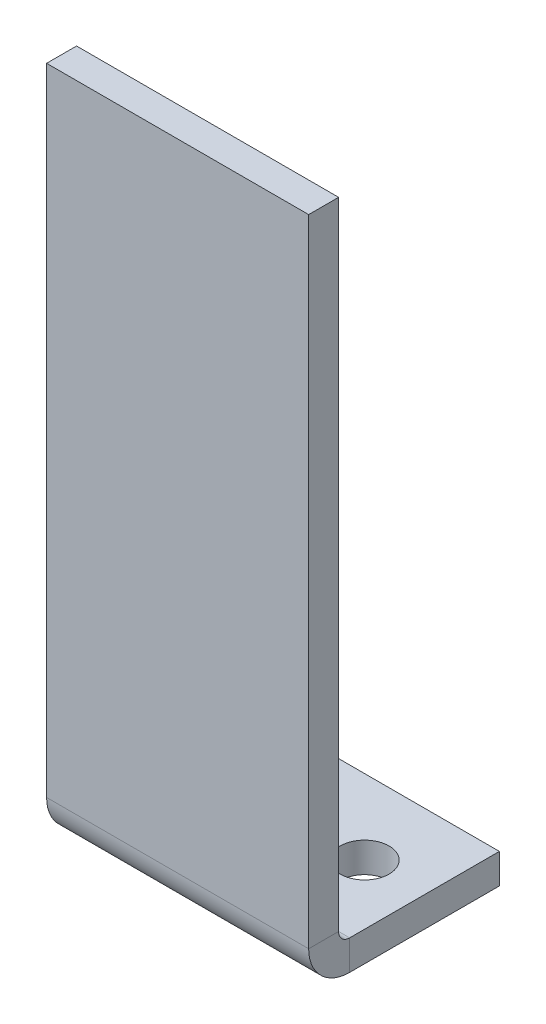
ISO-10303-21;
HEADER;
FILE_DESCRIPTION(('STEP AP214'),'2;1');
FILE_NAME('part.step','',(''),(''),'','','');
FILE_SCHEMA(('AUTOMOTIVE_DESIGN { 1 0 10303 214 1 1 1 1 }'));
ENDSEC;
DATA;
#1=APPLICATION_CONTEXT('core data for automotive mechanical design processes');
#2=APPLICATION_PROTOCOL_DEFINITION('international standard','automotive_design',2000,#1);
#3=PRODUCT_CONTEXT('',#1,'mechanical');
#4=PRODUCT('Part','Part','',(#3));
#5=PRODUCT_RELATED_PRODUCT_CATEGORY('part','',(#4));
#6=PRODUCT_DEFINITION_FORMATION('','',#4);
#7=PRODUCT_DEFINITION_CONTEXT('part definition',#1,'design');
#8=PRODUCT_DEFINITION('design','',#6,#7);
#9=PRODUCT_DEFINITION_SHAPE('','',#8);
#10=(LENGTH_UNIT() NAMED_UNIT(*) SI_UNIT(.MILLI.,.METRE.));
#11=(NAMED_UNIT(*) PLANE_ANGLE_UNIT() SI_UNIT($,.RADIAN.));
#12=(NAMED_UNIT(*) SI_UNIT($,.STERADIAN.) SOLID_ANGLE_UNIT());
#13=UNCERTAINTY_MEASURE_WITH_UNIT(LENGTH_MEASURE(1.E-05),#10,'distance_accuracy_value','');
#14=(GEOMETRIC_REPRESENTATION_CONTEXT(3) GLOBAL_UNCERTAINTY_ASSIGNED_CONTEXT((#13)) GLOBAL_UNIT_ASSIGNED_CONTEXT((#10,
#11,#12)) REPRESENTATION_CONTEXT('',''));
#15=CARTESIAN_POINT('',(0.,0.,0.));
#16=DIRECTION('',(0.,0.,1.));
#17=DIRECTION('',(1.,0.,0.));
#18=AXIS2_PLACEMENT_3D('',#15,#16,#17);
#19=CARTESIAN_POINT('',(0.,0.,0.));
#20=DIRECTION('',(0.,1.,0.));
#21=DIRECTION('',(0.,0.,1.));
#22=AXIS2_PLACEMENT_3D('',#19,#20,#21);
#23=PLANE('',#22);
#24=CARTESIAN_POINT('',(-19.2867132867133,0.,-16.3298368298368));
#25=DIRECTION('',(0.,1.,0.));
#26=DIRECTION('',(0.,0.,1.));
#27=AXIS2_PLACEMENT_3D('',#24,#25,#26);
#28=CIRCLE('',#27,1.63195);
#29=CARTESIAN_POINT('',(-19.2867132867133,0.,-14.6978868298368));
#30=VERTEX_POINT('',#29);
#31=EDGE_CURVE('E362',#30,#30,#28,.F.);
#32=ORIENTED_EDGE('',*,*,#31,.T.);
#33=EDGE_LOOP('',(#32));
#34=FACE_BOUND('',#33,.T.);
#35=DIRECTION('',(-1.,0.,0.));
#36=VECTOR('',#35,1.);
#37=CARTESIAN_POINT('',(0.,0.,-11.3298368298368));
#38=LINE('',#37,#36);
#39=CARTESIAN_POINT('',(-5.78671328671329,0.,-11.3298368298368));
#40=VERTEX_POINT('',#39);
#41=CARTESIAN_POINT('',(-23.2867132867133,0.,-11.3298368298368));
#42=VERTEX_POINT('',#41);
#43=EDGE_CURVE('E147',#40,#42,#38,.T.);
#44=ORIENTED_EDGE('',*,*,#43,.F.);
#45=DIRECTION('',(0.,0.,-1.));
#46=VECTOR('',#45,1.);
#47=CARTESIAN_POINT('',(-5.78671328671329,0.,-21.3298368298368));
#48=LINE('',#47,#46);
#49=CARTESIAN_POINT('',(-5.78671328671329,0.,-21.3298368298368));
#50=VERTEX_POINT('',#49);
#51=EDGE_CURVE('E168',#40,#50,#48,.T.);
#52=ORIENTED_EDGE('',*,*,#51,.T.);
#53=DIRECTION('',(-1.,0.,0.));
#54=VECTOR('',#53,1.);
#55=CARTESIAN_POINT('',(-23.2867132867133,0.,-21.3298368298368));
#56=LINE('',#55,#54);
#57=CARTESIAN_POINT('',(-23.2867132867133,0.,-21.3298368298368));
#58=VERTEX_POINT('',#57);
#59=EDGE_CURVE('E165',#50,#58,#56,.T.);
#60=ORIENTED_EDGE('',*,*,#59,.T.);
#61=DIRECTION('',(0.,0.,1.));
#62=VECTOR('',#61,1.);
#63=CARTESIAN_POINT('',(-23.2867132867133,0.,-21.3298368298368));
#64=LINE('',#63,#62);
#65=EDGE_CURVE('E163',#58,#42,#64,.T.);
#66=ORIENTED_EDGE('',*,*,#65,.T.);
#67=EDGE_LOOP('',(#44,#52,#60,#66));
#68=FACE_BOUND('',#67,.T.);
#69=CARTESIAN_POINT('',(-9.78671328671329,0.,-16.3298368298368));
#70=DIRECTION('',(0.,1.,0.));
#71=DIRECTION('',(0.,0.,1.));
#72=AXIS2_PLACEMENT_3D('',#69,#70,#71);
#73=CIRCLE('',#72,1.63195);
#74=CARTESIAN_POINT('',(-9.78671328671329,0.,-14.6978868298368));
#75=VERTEX_POINT('',#74);
#76=EDGE_CURVE('E157',#75,#75,#73,.F.);
#77=ORIENTED_EDGE('',*,*,#76,.T.);
#78=EDGE_LOOP('',(#77));
#79=FACE_BOUND('',#78,.T.);
#80=ADVANCED_FACE('F47',(#34,#68,#79),#23,.T.);
#81=CARTESIAN_POINT('',(-23.2867132867133,-11.8027493418966,-8.59323682983679));
#82=DIRECTION('',(-1.,0.,0.));
#83=DIRECTION('',(0.,1.,0.));
#84=AXIS2_PLACEMENT_3D('',#81,#82,#83);
#85=PLANE('',#84);
#86=DIRECTION('',(0.,1.,0.));
#87=VECTOR('',#86,1.);
#88=CARTESIAN_POINT('',(-23.2867132867133,-11.8027493418966,-10.5932368298368));
#89=LINE('',#88,#87);
#90=CARTESIAN_POINT('',(-23.2867132867133,0.736600000000002,-10.5932368298368));
#91=VERTEX_POINT('',#90);
#92=CARTESIAN_POINT('',(-23.2867132867133,43.1972506581034,-10.593236829837));
#93=VERTEX_POINT('',#92);
#94=EDGE_CURVE('E71',#91,#93,#89,.T.);
#95=ORIENTED_EDGE('',*,*,#94,.F.);
#96=DIRECTION('',(0.,0.,1.));
#97=VECTOR('',#96,1.);
#98=CARTESIAN_POINT('',(-23.2867132867133,0.736600000000009,-8.59323682983683));
#99=LINE('',#98,#97);
#100=CARTESIAN_POINT('',(-23.2867132867133,0.73660000000001,-8.59323682983683));
#101=VERTEX_POINT('',#100);
#102=EDGE_CURVE('E112',#91,#101,#99,.T.);
#103=ORIENTED_EDGE('',*,*,#102,.T.);
#104=DIRECTION('',(0.,1.,0.));
#105=VECTOR('',#104,1.);
#106=CARTESIAN_POINT('',(-23.2867132867133,-11.8027493418966,-8.59323682983679));
#107=LINE('',#106,#105);
#108=CARTESIAN_POINT('',(-23.2867132867133,43.1972506581034,-8.59323682983698));
#109=VERTEX_POINT('',#108);
#110=EDGE_CURVE('E51',#101,#109,#107,.T.);
#111=ORIENTED_EDGE('',*,*,#110,.T.);
#112=DIRECTION('',(0.,0.,-1.));
#113=VECTOR('',#112,1.);
#114=CARTESIAN_POINT('',(-23.2867132867133,43.1972506581034,-8.59323682983698));
#115=LINE('',#114,#113);
#116=EDGE_CURVE('E188',#109,#93,#115,.T.);
#117=ORIENTED_EDGE('',*,*,#116,.T.);
#118=EDGE_LOOP('',(#95,#103,#111,#117));
#119=FACE_BOUND('',#118,.T.);
#120=ADVANCED_FACE('F114',(#119),#85,.T.);
#121=CARTESIAN_POINT('',(-5.78671328671329,-11.8027493418966,-8.59323682983679));
#122=DIRECTION('',(1.,0.,0.));
#123=DIRECTION('',(0.,-1.,0.));
#124=AXIS2_PLACEMENT_3D('',#121,#122,#123);
#125=PLANE('',#124);
#126=DIRECTION('',(0.,-1.,0.));
#127=VECTOR('',#126,1.);
#128=CARTESIAN_POINT('',(-5.78671328671329,-11.8027493418966,-8.59323682983679));
#129=LINE('',#128,#127);
#130=CARTESIAN_POINT('',(-5.78671328671328,43.1972506581034,-8.59323682983698));
#131=VERTEX_POINT('',#130);
#132=CARTESIAN_POINT('',(-5.78671328671329,0.736600000000009,-8.59323682983683));
#133=VERTEX_POINT('',#132);
#134=EDGE_CURVE('E184',#131,#133,#129,.T.);
#135=ORIENTED_EDGE('',*,*,#134,.T.);
#136=DIRECTION('',(0.,0.,-1.));
#137=VECTOR('',#136,1.);
#138=CARTESIAN_POINT('',(-5.78671328671329,0.736600000000009,-8.59323682983683));
#139=LINE('',#138,#137);
#140=CARTESIAN_POINT('',(-5.78671328671329,0.736600000000002,-10.5932368298368));
#141=VERTEX_POINT('',#140);
#142=EDGE_CURVE('E12',#133,#141,#139,.T.);
#143=ORIENTED_EDGE('',*,*,#142,.T.);
#144=DIRECTION('',(0.,-1.,0.));
#145=VECTOR('',#144,1.);
#146=CARTESIAN_POINT('',(-5.78671328671329,-11.8027493418966,-10.5932368298368));
#147=LINE('',#146,#145);
#148=CARTESIAN_POINT('',(-5.78671328671328,43.1972506581034,-10.593236829837));
#149=VERTEX_POINT('',#148);
#150=EDGE_CURVE('E64',#149,#141,#147,.T.);
#151=ORIENTED_EDGE('',*,*,#150,.F.);
#152=DIRECTION('',(0.,0.,-1.));
#153=VECTOR('',#152,1.);
#154=CARTESIAN_POINT('',(-5.78671328671328,43.1972506581034,-8.59323682983698));
#155=LINE('',#154,#153);
#156=EDGE_CURVE('E138',#131,#149,#155,.T.);
#157=ORIENTED_EDGE('',*,*,#156,.F.);
#158=EDGE_LOOP('',(#135,#143,#151,#157));
#159=FACE_BOUND('',#158,.T.);
#160=ADVANCED_FACE('F49',(#159),#125,.T.);
#161=CARTESIAN_POINT('',(0.,9.52708748794019,-10.5932368298369));
#162=DIRECTION('',(0.,0.,-1.));
#163=DIRECTION('',(0.,1.,0.));
#164=AXIS2_PLACEMENT_3D('',#161,#162,#163);
#165=PLANE('',#164);
#166=ORIENTED_EDGE('',*,*,#150,.T.);
#167=DIRECTION('',(-1.,0.,0.));
#168=VECTOR('',#167,1.);
#169=CARTESIAN_POINT('',(0.,0.736600000000002,-10.5932368298368));
#170=LINE('',#169,#168);
#171=EDGE_CURVE('E56',#141,#91,#170,.T.);
#172=ORIENTED_EDGE('',*,*,#171,.T.);
#173=ORIENTED_EDGE('',*,*,#94,.T.);
#174=DIRECTION('',(1.,0.,0.));
#175=VECTOR('',#174,1.);
#176=CARTESIAN_POINT('',(-23.2867132867133,43.1972506581034,-10.593236829837));
#177=LINE('',#176,#175);
#178=EDGE_CURVE('E185',#93,#149,#177,.T.);
#179=ORIENTED_EDGE('',*,*,#178,.T.);
#180=EDGE_LOOP('',(#166,#172,#173,#179));
#181=FACE_BOUND('',#180,.T.);
#182=ADVANCED_FACE('F192',(#181),#165,.T.);
#183=CARTESIAN_POINT('',(-23.2867132867133,43.1972506581034,-8.59323682983698));
#184=DIRECTION('',(0.,1.,0.));
#185=DIRECTION('',(1.,0.,0.));
#186=AXIS2_PLACEMENT_3D('',#183,#184,#185);
#187=PLANE('',#186);
#188=ORIENTED_EDGE('',*,*,#178,.F.);
#189=ORIENTED_EDGE('',*,*,#116,.F.);
#190=DIRECTION('',(1.,0.,0.));
#191=VECTOR('',#190,1.);
#192=CARTESIAN_POINT('',(-23.2867132867133,43.1972506581034,-8.59323682983698));
#193=LINE('',#192,#191);
#194=EDGE_CURVE('E129',#109,#131,#193,.T.);
#195=ORIENTED_EDGE('',*,*,#194,.T.);
#196=ORIENTED_EDGE('',*,*,#156,.T.);
#197=EDGE_LOOP('',(#188,#189,#195,#196));
#198=FACE_BOUND('',#197,.T.);
#199=ADVANCED_FACE('F196',(#198),#187,.T.);
#200=CARTESIAN_POINT('',(0.,9.5270874879402,-8.59323682983686));
#201=DIRECTION('',(0.,0.,-1.));
#202=DIRECTION('',(0.,1.,0.));
#203=AXIS2_PLACEMENT_3D('',#200,#201,#202);
#204=PLANE('',#203);
#205=DIRECTION('',(-1.,0.,0.));
#206=VECTOR('',#205,1.);
#207=CARTESIAN_POINT('',(0.,0.736600000000009,-8.59323682983683));
#208=LINE('',#207,#206);
#209=EDGE_CURVE('E120',#133,#101,#208,.T.);
#210=ORIENTED_EDGE('',*,*,#209,.F.);
#211=ORIENTED_EDGE('',*,*,#134,.F.);
#212=ORIENTED_EDGE('',*,*,#194,.F.);
#213=ORIENTED_EDGE('',*,*,#110,.F.);
#214=EDGE_LOOP('',(#210,#211,#212,#213));
#215=FACE_BOUND('',#214,.T.);
#216=ADVANCED_FACE('F125',(#215),#204,.F.);
#217=CARTESIAN_POINT('',(-23.2867132867133,-2.,-21.3298368298368));
#218=DIRECTION('',(0.,0.,-1.));
#219=DIRECTION('',(-1.,0.,0.));
#220=AXIS2_PLACEMENT_3D('',#217,#218,#219);
#221=PLANE('',#220);
#222=ORIENTED_EDGE('',*,*,#59,.F.);
#223=DIRECTION('',(0.,1.,0.));
#224=VECTOR('',#223,1.);
#225=CARTESIAN_POINT('',(-5.78671328671329,-2.,-21.3298368298368));
#226=LINE('',#225,#224);
#227=CARTESIAN_POINT('',(-5.78671328671329,-2.,-21.3298368298368));
#228=VERTEX_POINT('',#227);
#229=EDGE_CURVE('E158',#228,#50,#226,.T.);
#230=ORIENTED_EDGE('',*,*,#229,.F.);
#231=DIRECTION('',(-1.,0.,0.));
#232=VECTOR('',#231,1.);
#233=CARTESIAN_POINT('',(-23.2867132867133,-2.,-21.3298368298368));
#234=LINE('',#233,#232);
#235=CARTESIAN_POINT('',(-23.2867132867133,-2.,-21.3298368298368));
#236=VERTEX_POINT('',#235);
#237=EDGE_CURVE('E177',#228,#236,#234,.T.);
#238=ORIENTED_EDGE('',*,*,#237,.T.);
#239=DIRECTION('',(0.,1.,0.));
#240=VECTOR('',#239,1.);
#241=CARTESIAN_POINT('',(-23.2867132867133,-2.,-21.3298368298368));
#242=LINE('',#241,#240);
#243=EDGE_CURVE('E175',#236,#58,#242,.T.);
#244=ORIENTED_EDGE('',*,*,#243,.T.);
#245=EDGE_LOOP('',(#222,#230,#238,#244));
#246=FACE_BOUND('',#245,.T.);
#247=ADVANCED_FACE('F220',(#246),#221,.T.);
#248=CARTESIAN_POINT('',(0.,-2.,0.));
#249=DIRECTION('',(0.,1.,0.));
#250=DIRECTION('',(0.,0.,1.));
#251=AXIS2_PLACEMENT_3D('',#248,#249,#250);
#252=PLANE('',#251);
#253=CARTESIAN_POINT('',(-19.2867132867133,-2.,-16.3298368298368));
#254=DIRECTION('',(0.,-1.,0.));
#255=DIRECTION('',(0.,0.,-1.));
#256=AXIS2_PLACEMENT_3D('',#253,#254,#255);
#257=CIRCLE('',#256,1.63195);
#258=CARTESIAN_POINT('',(-19.2867132867133,-2.,-17.9617868298368));
#259=VERTEX_POINT('',#258);
#260=EDGE_CURVE('E365',#259,#259,#257,.T.);
#261=ORIENTED_EDGE('',*,*,#260,.F.);
#262=EDGE_LOOP('',(#261));
#263=FACE_BOUND('',#262,.T.);
#264=CARTESIAN_POINT('',(-9.78671328671329,-2.,-16.3298368298368));
#265=DIRECTION('',(0.,-1.,0.));
#266=DIRECTION('',(0.,0.,-1.));
#267=AXIS2_PLACEMENT_3D('',#264,#265,#266);
#268=CIRCLE('',#267,1.63195);
#269=CARTESIAN_POINT('',(-9.78671328671329,-2.,-17.9617868298368));
#270=VERTEX_POINT('',#269);
#271=EDGE_CURVE('E367',#270,#270,#268,.T.);
#272=ORIENTED_EDGE('',*,*,#271,.F.);
#273=EDGE_LOOP('',(#272));
#274=FACE_BOUND('',#273,.T.);
#275=DIRECTION('',(0.,0.,-1.));
#276=VECTOR('',#275,1.);
#277=CARTESIAN_POINT('',(-5.78671328671329,-2.,-21.3298368298368));
#278=LINE('',#277,#276);
#279=CARTESIAN_POINT('',(-5.78671328671329,-2.,-11.3298368298368));
#280=VERTEX_POINT('',#279);
#281=EDGE_CURVE('E161',#280,#228,#278,.T.);
#282=ORIENTED_EDGE('',*,*,#281,.F.);
#283=DIRECTION('',(-1.,0.,0.));
#284=VECTOR('',#283,1.);
#285=CARTESIAN_POINT('',(0.,-2.,-11.3298368298368));
#286=LINE('',#285,#284);
#287=CARTESIAN_POINT('',(-23.2867132867133,-2.,-11.3298368298368));
#288=VERTEX_POINT('',#287);
#289=EDGE_CURVE('E172',#280,#288,#286,.T.);
#290=ORIENTED_EDGE('',*,*,#289,.T.);
#291=DIRECTION('',(0.,0.,1.));
#292=VECTOR('',#291,1.);
#293=CARTESIAN_POINT('',(-23.2867132867133,-2.,-21.3298368298368));
#294=LINE('',#293,#292);
#295=EDGE_CURVE('E170',#236,#288,#294,.T.);
#296=ORIENTED_EDGE('',*,*,#295,.F.);
#297=ORIENTED_EDGE('',*,*,#237,.F.);
#298=EDGE_LOOP('',(#282,#290,#296,#297));
#299=FACE_BOUND('',#298,.T.);
#300=ADVANCED_FACE('F218',(#263,#274,#299),#252,.F.);
#301=CARTESIAN_POINT('',(-23.2867132867133,-2.,-21.3298368298368));
#302=DIRECTION('',(-1.,0.,0.));
#303=DIRECTION('',(0.,0.,1.));
#304=AXIS2_PLACEMENT_3D('',#301,#302,#303);
#305=PLANE('',#304);
#306=DIRECTION('',(0.,-1.,0.));
#307=VECTOR('',#306,1.);
#308=CARTESIAN_POINT('',(-23.2867132867133,-2.,-11.3298368298368));
#309=LINE('',#308,#307);
#310=EDGE_CURVE('E143',#42,#288,#309,.T.);
#311=ORIENTED_EDGE('',*,*,#310,.F.);
#312=ORIENTED_EDGE('',*,*,#65,.F.);
#313=ORIENTED_EDGE('',*,*,#243,.F.);
#314=ORIENTED_EDGE('',*,*,#295,.T.);
#315=EDGE_LOOP('',(#311,#312,#313,#314));
#316=FACE_BOUND('',#315,.T.);
#317=ADVANCED_FACE('F214',(#316),#305,.T.);
#318=CARTESIAN_POINT('',(-5.78671328671329,-2.,-21.3298368298368));
#319=DIRECTION('',(1.,0.,0.));
#320=DIRECTION('',(0.,0.,-1.));
#321=AXIS2_PLACEMENT_3D('',#318,#319,#320);
#322=PLANE('',#321);
#323=DIRECTION('',(0.,1.,0.));
#324=VECTOR('',#323,1.);
#325=CARTESIAN_POINT('',(-5.78671328671329,-2.,-11.3298368298368));
#326=LINE('',#325,#324);
#327=EDGE_CURVE('E144',#280,#40,#326,.T.);
#328=ORIENTED_EDGE('',*,*,#327,.F.);
#329=ORIENTED_EDGE('',*,*,#281,.T.);
#330=ORIENTED_EDGE('',*,*,#229,.T.);
#331=ORIENTED_EDGE('',*,*,#51,.F.);
#332=EDGE_LOOP('',(#328,#329,#330,#331));
#333=FACE_BOUND('',#332,.T.);
#334=ADVANCED_FACE('F206',(#333),#322,.T.);
#335=CARTESIAN_POINT('',(-5.78671328671328,0.7366,-11.3298368298368));
#336=DIRECTION('',(1.,0.,0.));
#337=DIRECTION('',(0.,0.,-1.));
#338=AXIS2_PLACEMENT_3D('',#335,#336,#337);
#339=PLANE('',#338);
#340=ORIENTED_EDGE('',*,*,#327,.T.);
#341=CARTESIAN_POINT('',(-5.78671328671328,0.7366,-11.3298368298368));
#342=DIRECTION('',(-1.,0.,0.));
#343=DIRECTION('',(0.,0.,1.));
#344=AXIS2_PLACEMENT_3D('',#341,#342,#343);
#345=CIRCLE('',#344,0.7366);
#346=EDGE_CURVE('E154',#40,#141,#345,.T.);
#347=ORIENTED_EDGE('',*,*,#346,.T.);
#348=ORIENTED_EDGE('',*,*,#142,.F.);
#349=CARTESIAN_POINT('',(-5.78671328671328,0.7366,-11.3298368298368));
#350=DIRECTION('',(-1.,0.,0.));
#351=DIRECTION('',(0.,0.,-1.));
#352=AXIS2_PLACEMENT_3D('',#349,#350,#351);
#353=CIRCLE('',#352,2.7366);
#354=EDGE_CURVE('E137',#280,#133,#353,.T.);
#355=ORIENTED_EDGE('',*,*,#354,.F.);
#356=EDGE_LOOP('',(#340,#347,#348,#355));
#357=FACE_BOUND('',#356,.T.);
#358=ADVANCED_FACE('F203',(#357),#339,.T.);
#359=CARTESIAN_POINT('',(-23.2867132867133,0.7366,-11.3298368298368));
#360=DIRECTION('',(-1.,0.,0.));
#361=DIRECTION('',(0.,0.,1.));
#362=AXIS2_PLACEMENT_3D('',#359,#360,#361);
#363=PLANE('',#362);
#364=ORIENTED_EDGE('',*,*,#102,.F.);
#365=CARTESIAN_POINT('',(-23.2867132867133,0.7366,-11.3298368298368));
#366=DIRECTION('',(-1.,0.,0.));
#367=DIRECTION('',(0.,0.,1.));
#368=AXIS2_PLACEMENT_3D('',#365,#366,#367);
#369=CIRCLE('',#368,0.7366);
#370=EDGE_CURVE('E149',#91,#42,#369,.F.);
#371=ORIENTED_EDGE('',*,*,#370,.T.);
#372=ORIENTED_EDGE('',*,*,#310,.T.);
#373=CARTESIAN_POINT('',(-23.2867132867133,0.7366,-11.3298368298368));
#374=DIRECTION('',(1.,0.,0.));
#375=DIRECTION('',(0.,0.,1.));
#376=AXIS2_PLACEMENT_3D('',#373,#374,#375);
#377=CIRCLE('',#376,2.7366);
#378=EDGE_CURVE('E135',#101,#288,#377,.T.);
#379=ORIENTED_EDGE('',*,*,#378,.F.);
#380=EDGE_LOOP('',(#364,#371,#372,#379));
#381=FACE_BOUND('',#380,.T.);
#382=ADVANCED_FACE('F141',(#381),#363,.T.);
#383=CARTESIAN_POINT('',(3.25930579285029,0.7366,-11.3298368298368));
#384=DIRECTION('',(-1.,0.,0.));
#385=DIRECTION('',(0.,0.,1.));
#386=AXIS2_PLACEMENT_3D('',#383,#384,#385);
#387=CYLINDRICAL_SURFACE('',#386,2.7366);
#388=ORIENTED_EDGE('',*,*,#378,.T.);
#389=ORIENTED_EDGE('',*,*,#289,.F.);
#390=ORIENTED_EDGE('',*,*,#354,.T.);
#391=ORIENTED_EDGE('',*,*,#209,.T.);
#392=EDGE_LOOP('',(#388,#389,#390,#391));
#393=FACE_BOUND('',#392,.T.);
#394=ADVANCED_FACE('F133',(#393),#387,.T.);
#395=CARTESIAN_POINT('',(3.25930579285029,0.7366,-11.3298368298368));
#396=DIRECTION('',(-1.,0.,0.));
#397=DIRECTION('',(0.,0.,1.));
#398=AXIS2_PLACEMENT_3D('',#395,#396,#397);
#399=CYLINDRICAL_SURFACE('',#398,0.7366);
#400=ORIENTED_EDGE('',*,*,#370,.F.);
#401=ORIENTED_EDGE('',*,*,#171,.F.);
#402=ORIENTED_EDGE('',*,*,#346,.F.);
#403=ORIENTED_EDGE('',*,*,#43,.T.);
#404=EDGE_LOOP('',(#400,#401,#402,#403));
#405=FACE_BOUND('',#404,.T.);
#406=ADVANCED_FACE('F202',(#405),#399,.F.);
#407=CARTESIAN_POINT('',(-9.78671328671329,-2.,-16.3298368298368));
#408=DIRECTION('',(0.,-1.,0.));
#409=DIRECTION('',(0.,0.,-1.));
#410=AXIS2_PLACEMENT_3D('',#407,#408,#409);
#411=CYLINDRICAL_SURFACE('',#410,1.63195);
#412=ORIENTED_EDGE('',*,*,#76,.F.);
#413=EDGE_LOOP('',(#412));
#414=FACE_BOUND('',#413,.T.);
#415=ORIENTED_EDGE('',*,*,#271,.T.);
#416=EDGE_LOOP('',(#415));
#417=FACE_BOUND('',#416,.T.);
#418=ADVANCED_FACE('F332',(#414,#417),#411,.F.);
#419=CARTESIAN_POINT('',(-19.2867132867133,-2.,-16.3298368298368));
#420=DIRECTION('',(0.,-1.,0.));
#421=DIRECTION('',(0.,0.,-1.));
#422=AXIS2_PLACEMENT_3D('',#419,#420,#421);
#423=CYLINDRICAL_SURFACE('',#422,1.63195);
#424=ORIENTED_EDGE('',*,*,#31,.F.);
#425=EDGE_LOOP('',(#424));
#426=FACE_BOUND('',#425,.T.);
#427=ORIENTED_EDGE('',*,*,#260,.T.);
#428=EDGE_LOOP('',(#427));
#429=FACE_BOUND('',#428,.T.);
#430=ADVANCED_FACE('F347',(#426,#429),#423,.F.);
#431=CLOSED_SHELL('',(#80,#120,#160,#182,#199,#216,#247,#300,#317,#334,#358,#382,#394,#406,#418,#430));
#432=MANIFOLD_SOLID_BREP('B2',#431);
#433=ADVANCED_BREP_SHAPE_REPRESENTATION('',(#18,#432),#14);
#434=SHAPE_DEFINITION_REPRESENTATION(#9,#433);
ENDSEC;
END-ISO-10303-21;
